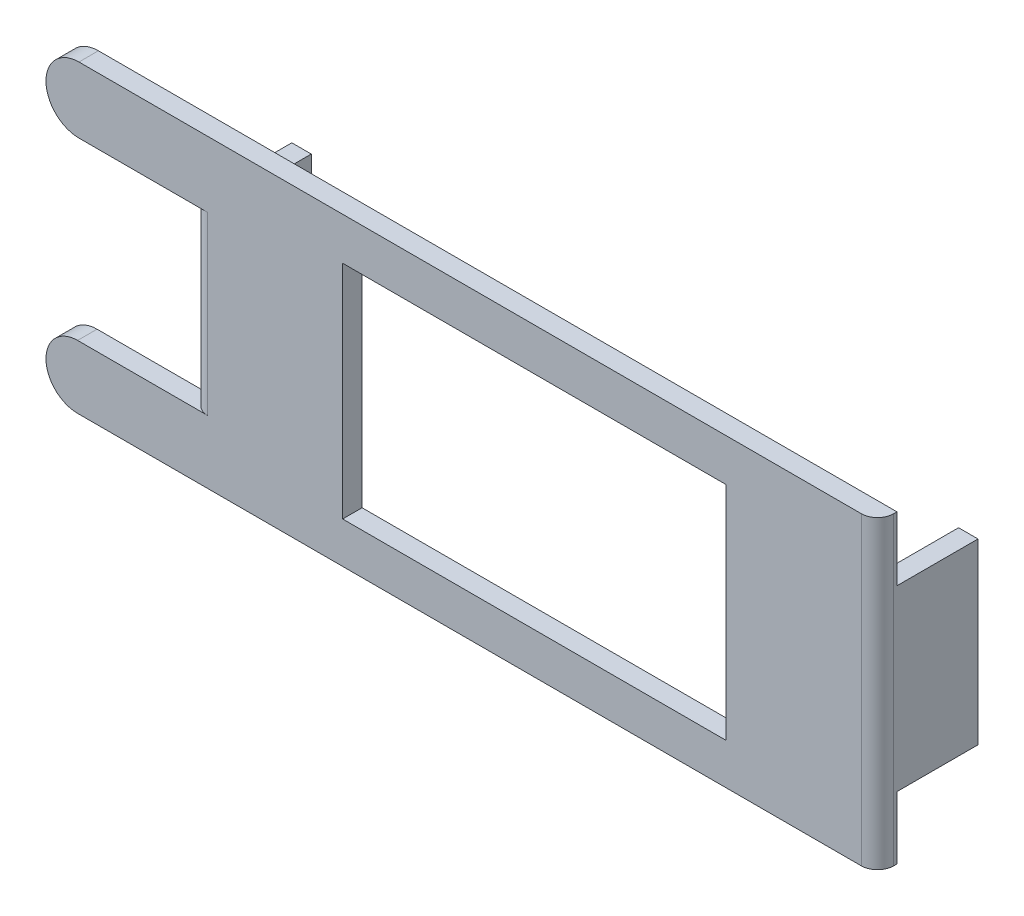
ISO-10303-21;
HEADER;
FILE_DESCRIPTION(('STEP AP214'),'2;1');
FILE_NAME('part.step','',(''),(''),'','','');
FILE_SCHEMA(('AUTOMOTIVE_DESIGN { 1 0 10303 214 1 1 1 1 }'));
ENDSEC;
DATA;
#1=APPLICATION_CONTEXT('core data for automotive mechanical design processes');
#2=APPLICATION_PROTOCOL_DEFINITION('international standard','automotive_design',2000,#1);
#3=PRODUCT_CONTEXT('',#1,'mechanical');
#4=PRODUCT('Part','Part','',(#3));
#5=PRODUCT_RELATED_PRODUCT_CATEGORY('part','',(#4));
#6=PRODUCT_DEFINITION_FORMATION('','',#4);
#7=PRODUCT_DEFINITION_CONTEXT('part definition',#1,'design');
#8=PRODUCT_DEFINITION('design','',#6,#7);
#9=PRODUCT_DEFINITION_SHAPE('','',#8);
#10=(LENGTH_UNIT() NAMED_UNIT(*) SI_UNIT(.MILLI.,.METRE.));
#11=(NAMED_UNIT(*) PLANE_ANGLE_UNIT() SI_UNIT($,.RADIAN.));
#12=(NAMED_UNIT(*) SI_UNIT($,.STERADIAN.) SOLID_ANGLE_UNIT());
#13=UNCERTAINTY_MEASURE_WITH_UNIT(LENGTH_MEASURE(1.E-05),#10,'distance_accuracy_value','');
#14=(GEOMETRIC_REPRESENTATION_CONTEXT(3) GLOBAL_UNCERTAINTY_ASSIGNED_CONTEXT((#13)) GLOBAL_UNIT_ASSIGNED_CONTEXT((#10,
#11,#12)) REPRESENTATION_CONTEXT('',''));
#15=CARTESIAN_POINT('',(0.,0.,0.));
#16=DIRECTION('',(0.,0.,1.));
#17=DIRECTION('',(1.,0.,0.));
#18=AXIS2_PLACEMENT_3D('',#15,#16,#17);
#19=CARTESIAN_POINT('',(-6.35,-1.64,0.));
#20=DIRECTION('',(-1.,0.,0.));
#21=DIRECTION('',(0.,0.,1.));
#22=AXIS2_PLACEMENT_3D('',#19,#20,#21);
#23=PLANE('',#22);
#24=DIRECTION('',(0.,1.,0.));
#25=VECTOR('',#24,1.);
#26=CARTESIAN_POINT('',(-6.35,-1.64,0.));
#27=LINE('',#26,#25);
#28=CARTESIAN_POINT('',(-6.35,-1.65,0.));
#29=VERTEX_POINT('',#28);
#30=CARTESIAN_POINT('',(-6.35,-1.64,0.));
#31=VERTEX_POINT('',#30);
#32=EDGE_CURVE('E233',#29,#31,#27,.T.);
#33=ORIENTED_EDGE('',*,*,#32,.T.);
#34=DIRECTION('',(0.,0.,1.));
#35=VECTOR('',#34,1.);
#36=CARTESIAN_POINT('',(-6.35,-1.64,0.));
#37=LINE('',#36,#35);
#38=CARTESIAN_POINT('',(-6.35,-1.64,0.06));
#39=VERTEX_POINT('',#38);
#40=EDGE_CURVE('E231',#31,#39,#37,.T.);
#41=ORIENTED_EDGE('',*,*,#40,.T.);
#42=DIRECTION('',(0.,1.,0.));
#43=VECTOR('',#42,1.);
#44=CARTESIAN_POINT('',(-6.35,-0.815574764208665,0.0599999999999999));
#45=LINE('',#44,#43);
#46=CARTESIAN_POINT('',(-6.35,1.615,0.06));
#47=VERTEX_POINT('',#46);
#48=EDGE_CURVE('E227',#47,#39,#45,.F.);
#49=ORIENTED_EDGE('',*,*,#48,.F.);
#50=DIRECTION('',(0.,0.,1.));
#51=VECTOR('',#50,1.);
#52=CARTESIAN_POINT('',(-6.35,1.615,0.));
#53=LINE('',#52,#51);
#54=CARTESIAN_POINT('',(-6.35,1.615,0.));
#55=VERTEX_POINT('',#54);
#56=EDGE_CURVE('E222',#47,#55,#53,.F.);
#57=ORIENTED_EDGE('',*,*,#56,.T.);
#58=DIRECTION('',(0.,1.,0.));
#59=VECTOR('',#58,1.);
#60=CARTESIAN_POINT('',(-6.35,-1.64,0.));
#61=LINE('',#60,#59);
#62=CARTESIAN_POINT('',(-6.35,1.65,0.));
#63=VERTEX_POINT('',#62);
#64=EDGE_CURVE('E224',#55,#63,#61,.T.);
#65=ORIENTED_EDGE('',*,*,#64,.T.);
#66=DIRECTION('',(0.,0.,1.));
#67=VECTOR('',#66,1.);
#68=CARTESIAN_POINT('',(-6.35,1.65,0.));
#69=LINE('',#68,#67);
#70=CARTESIAN_POINT('',(-6.35,1.65,-1.5));
#71=VERTEX_POINT('',#70);
#72=EDGE_CURVE('E285',#63,#71,#69,.F.);
#73=ORIENTED_EDGE('',*,*,#72,.T.);
#74=DIRECTION('',(0.,1.,0.));
#75=VECTOR('',#74,1.);
#76=CARTESIAN_POINT('',(-6.35,0.,-1.5));
#77=LINE('',#76,#75);
#78=CARTESIAN_POINT('',(-6.35,-1.65,-1.5));
#79=VERTEX_POINT('',#78);
#80=EDGE_CURVE('E221',#71,#79,#77,.F.);
#81=ORIENTED_EDGE('',*,*,#80,.T.);
#82=DIRECTION('',(0.,0.,1.));
#83=VECTOR('',#82,1.);
#84=CARTESIAN_POINT('',(-6.35,-1.65,0.));
#85=LINE('',#84,#83);
#86=EDGE_CURVE('E276',#79,#29,#85,.T.);
#87=ORIENTED_EDGE('',*,*,#86,.T.);
#88=EDGE_LOOP('',(#33,#41,#49,#57,#65,#73,#81,#87));
#89=FACE_BOUND('',#88,.T.);
#90=ADVANCED_FACE('F17',(#89),#23,.T.);
#91=CARTESIAN_POINT('',(6.35,2.835,0.));
#92=DIRECTION('',(1.,0.,0.));
#93=DIRECTION('',(0.,0.,-1.));
#94=AXIS2_PLACEMENT_3D('',#91,#92,#93);
#95=PLANE('',#94);
#96=DIRECTION('',(0.,1.,0.));
#97=VECTOR('',#96,1.);
#98=CARTESIAN_POINT('',(6.35,2.835,0.));
#99=LINE('',#98,#97);
#100=CARTESIAN_POINT('',(6.35,1.65,0.));
#101=VERTEX_POINT('',#100);
#102=CARTESIAN_POINT('',(6.35,2.835,0.));
#103=VERTEX_POINT('',#102);
#104=EDGE_CURVE('E238',#101,#103,#99,.T.);
#105=ORIENTED_EDGE('',*,*,#104,.T.);
#106=DIRECTION('',(0.,0.,-1.));
#107=VECTOR('',#106,1.);
#108=CARTESIAN_POINT('',(6.35,2.835,0.));
#109=LINE('',#108,#107);
#110=CARTESIAN_POINT('',(6.35,2.835,0.06));
#111=VERTEX_POINT('',#110);
#112=EDGE_CURVE('E174',#103,#111,#109,.F.);
#113=ORIENTED_EDGE('',*,*,#112,.T.);
#114=DIRECTION('',(0.,-1.,0.));
#115=VECTOR('',#114,1.);
#116=CARTESIAN_POINT('',(6.35,1.42192523579134,0.06));
#117=LINE('',#116,#115);
#118=CARTESIAN_POINT('',(6.35,-2.81,0.06));
#119=VERTEX_POINT('',#118);
#120=EDGE_CURVE('E173',#119,#111,#117,.F.);
#121=ORIENTED_EDGE('',*,*,#120,.F.);
#122=DIRECTION('',(0.,0.,-1.));
#123=VECTOR('',#122,1.);
#124=CARTESIAN_POINT('',(6.35,-2.81,0.));
#125=LINE('',#124,#123);
#126=CARTESIAN_POINT('',(6.35,-2.81,0.));
#127=VERTEX_POINT('',#126);
#128=EDGE_CURVE('E169',#119,#127,#125,.T.);
#129=ORIENTED_EDGE('',*,*,#128,.T.);
#130=DIRECTION('',(0.,1.,0.));
#131=VECTOR('',#130,1.);
#132=CARTESIAN_POINT('',(6.35,2.835,0.));
#133=LINE('',#132,#131);
#134=CARTESIAN_POINT('',(6.35,-1.65,0.));
#135=VERTEX_POINT('',#134);
#136=EDGE_CURVE('E242',#127,#135,#133,.T.);
#137=ORIENTED_EDGE('',*,*,#136,.T.);
#138=DIRECTION('',(0.,0.,-1.));
#139=VECTOR('',#138,1.);
#140=CARTESIAN_POINT('',(6.35,-1.65,0.));
#141=LINE('',#140,#139);
#142=CARTESIAN_POINT('',(6.35,-1.65,-1.5));
#143=VERTEX_POINT('',#142);
#144=EDGE_CURVE('E255',#135,#143,#141,.T.);
#145=ORIENTED_EDGE('',*,*,#144,.T.);
#146=DIRECTION('',(0.,1.,0.));
#147=VECTOR('',#146,1.);
#148=CARTESIAN_POINT('',(6.35,0.,-1.5));
#149=LINE('',#148,#147);
#150=CARTESIAN_POINT('',(6.35,1.65,-1.5));
#151=VERTEX_POINT('',#150);
#152=EDGE_CURVE('E216',#143,#151,#149,.T.);
#153=ORIENTED_EDGE('',*,*,#152,.T.);
#154=DIRECTION('',(0.,0.,-1.));
#155=VECTOR('',#154,1.);
#156=CARTESIAN_POINT('',(6.35,1.65,0.));
#157=LINE('',#156,#155);
#158=EDGE_CURVE('E246',#151,#101,#157,.F.);
#159=ORIENTED_EDGE('',*,*,#158,.T.);
#160=EDGE_LOOP('',(#105,#113,#121,#129,#137,#145,#153,#159));
#161=FACE_BOUND('',#160,.T.);
#162=ADVANCED_FACE('F406',(#161),#95,.T.);
#163=CARTESIAN_POINT('',(6.05,1.42192523579134,0.06));
#164=DIRECTION('',(0.,-1.,0.));
#165=DIRECTION('',(0.,0.,-1.));
#166=AXIS2_PLACEMENT_3D('',#163,#164,#165);
#167=CYLINDRICAL_SURFACE('',#166,0.3);
#168=CARTESIAN_POINT('',(6.05,2.835,0.06));
#169=DIRECTION('',(0.,-1.,0.));
#170=DIRECTION('',(0.,0.,-1.));
#171=AXIS2_PLACEMENT_3D('',#168,#169,#170);
#172=CIRCLE('',#171,0.3);
#173=CARTESIAN_POINT('',(6.05,2.835,0.36));
#174=VERTEX_POINT('',#173);
#175=EDGE_CURVE('E179',#111,#174,#172,.T.);
#176=ORIENTED_EDGE('',*,*,#175,.T.);
#177=DIRECTION('',(0.,1.,0.));
#178=VECTOR('',#177,1.);
#179=CARTESIAN_POINT('',(6.05,0.008850471582671,0.36));
#180=LINE('',#179,#178);
#181=CARTESIAN_POINT('',(6.05,-2.81,0.36));
#182=VERTEX_POINT('',#181);
#183=EDGE_CURVE('E176',#182,#174,#180,.T.);
#184=ORIENTED_EDGE('',*,*,#183,.F.);
#185=CARTESIAN_POINT('',(6.05,-2.81,0.06));
#186=DIRECTION('',(0.,-1.,0.));
#187=DIRECTION('',(0.,0.,-1.));
#188=AXIS2_PLACEMENT_3D('',#185,#186,#187);
#189=CIRCLE('',#188,0.3);
#190=EDGE_CURVE('E20',#182,#119,#189,.F.);
#191=ORIENTED_EDGE('',*,*,#190,.T.);
#192=ORIENTED_EDGE('',*,*,#120,.T.);
#193=EDGE_LOOP('',(#176,#184,#191,#192));
#194=FACE_BOUND('',#193,.T.);
#195=ADVANCED_FACE('F177',(#194),#167,.T.);
#196=CARTESIAN_POINT('',(-6.05,-0.815574764208665,0.06));
#197=DIRECTION('',(0.,1.,0.));
#198=DIRECTION('',(0.,0.,1.));
#199=AXIS2_PLACEMENT_3D('',#196,#197,#198);
#200=CYLINDRICAL_SURFACE('',#199,0.3);
#201=CARTESIAN_POINT('',(-6.05,1.615,0.06));
#202=DIRECTION('',(0.,1.,0.));
#203=DIRECTION('',(0.,0.,1.));
#204=AXIS2_PLACEMENT_3D('',#201,#202,#203);
#205=CIRCLE('',#204,0.3);
#206=CARTESIAN_POINT('',(-6.05,1.615,0.36));
#207=VERTEX_POINT('',#206);
#208=EDGE_CURVE('E230',#207,#47,#205,.F.);
#209=ORIENTED_EDGE('',*,*,#208,.T.);
#210=ORIENTED_EDGE('',*,*,#48,.T.);
#211=CARTESIAN_POINT('',(-6.05,-1.64,0.06));
#212=DIRECTION('',(0.,1.,0.));
#213=DIRECTION('',(0.,0.,1.));
#214=AXIS2_PLACEMENT_3D('',#211,#212,#213);
#215=CIRCLE('',#214,0.3);
#216=CARTESIAN_POINT('',(-6.05,-1.64,0.36));
#217=VERTEX_POINT('',#216);
#218=EDGE_CURVE('E320',#39,#217,#215,.T.);
#219=ORIENTED_EDGE('',*,*,#218,.T.);
#220=DIRECTION('',(0.,1.,0.));
#221=VECTOR('',#220,1.);
#222=CARTESIAN_POINT('',(-6.05,0.008850471582671,0.36));
#223=LINE('',#222,#221);
#224=EDGE_CURVE('E183',#207,#217,#223,.F.);
#225=ORIENTED_EDGE('',*,*,#224,.F.);
#226=EDGE_LOOP('',(#209,#210,#219,#225));
#227=FACE_BOUND('',#226,.T.);
#228=ADVANCED_FACE('F324',(#227),#200,.T.);
#229=CARTESIAN_POINT('',(-6.17,0.,-1.5));
#230=DIRECTION('',(0.,0.,1.));
#231=DIRECTION('',(1.,0.,0.));
#232=AXIS2_PLACEMENT_3D('',#229,#230,#231);
#233=PLANE('',#232);
#234=DIRECTION('',(1.,0.,0.));
#235=VECTOR('',#234,1.);
#236=CARTESIAN_POINT('',(-6.35,-1.65,-1.5));
#237=LINE('',#236,#235);
#238=CARTESIAN_POINT('',(-5.99,-1.65,-1.5));
#239=VERTEX_POINT('',#238);
#240=EDGE_CURVE('E281',#79,#239,#237,.T.);
#241=ORIENTED_EDGE('',*,*,#240,.F.);
#242=ORIENTED_EDGE('',*,*,#80,.F.);
#243=DIRECTION('',(1.,0.,0.));
#244=VECTOR('',#243,1.);
#245=CARTESIAN_POINT('',(-5.99,1.65,-1.5));
#246=LINE('',#245,#244);
#247=CARTESIAN_POINT('',(-5.99,1.65,-1.5));
#248=VERTEX_POINT('',#247);
#249=EDGE_CURVE('E217',#248,#71,#246,.F.);
#250=ORIENTED_EDGE('',*,*,#249,.F.);
#251=DIRECTION('',(0.,1.,0.));
#252=VECTOR('',#251,1.);
#253=CARTESIAN_POINT('',(-5.99,-1.65,-1.5));
#254=LINE('',#253,#252);
#255=EDGE_CURVE('E208',#239,#248,#254,.T.);
#256=ORIENTED_EDGE('',*,*,#255,.F.);
#257=EDGE_LOOP('',(#241,#242,#250,#256));
#258=FACE_BOUND('',#257,.T.);
#259=ADVANCED_FACE('F496',(#258),#233,.F.);
#260=CARTESIAN_POINT('',(-5.99,1.65,0.));
#261=DIRECTION('',(0.,1.,0.));
#262=DIRECTION('',(0.,0.,1.));
#263=AXIS2_PLACEMENT_3D('',#260,#261,#262);
#264=PLANE('',#263);
#265=DIRECTION('',(1.,0.,0.));
#266=VECTOR('',#265,1.);
#267=CARTESIAN_POINT('',(-5.99,1.65,0.));
#268=LINE('',#267,#266);
#269=CARTESIAN_POINT('',(-5.99,1.65,0.));
#270=VERTEX_POINT('',#269);
#271=EDGE_CURVE('E220',#63,#270,#268,.T.);
#272=ORIENTED_EDGE('',*,*,#271,.T.);
#273=DIRECTION('',(0.,0.,-1.));
#274=VECTOR('',#273,1.);
#275=CARTESIAN_POINT('',(-5.99,1.65,0.));
#276=LINE('',#275,#274);
#277=EDGE_CURVE('E205',#248,#270,#276,.F.);
#278=ORIENTED_EDGE('',*,*,#277,.F.);
#279=ORIENTED_EDGE('',*,*,#249,.T.);
#280=ORIENTED_EDGE('',*,*,#72,.F.);
#281=EDGE_LOOP('',(#272,#278,#279,#280));
#282=FACE_BOUND('',#281,.T.);
#283=ADVANCED_FACE('F492',(#282),#264,.T.);
#284=CARTESIAN_POINT('',(-6.35,-1.65,0.));
#285=DIRECTION('',(0.,-1.,0.));
#286=DIRECTION('',(0.,0.,-1.));
#287=AXIS2_PLACEMENT_3D('',#284,#285,#286);
#288=PLANE('',#287);
#289=DIRECTION('',(1.,0.,0.));
#290=VECTOR('',#289,1.);
#291=CARTESIAN_POINT('',(-6.35,-1.65,0.));
#292=LINE('',#291,#290);
#293=CARTESIAN_POINT('',(-5.99,-1.65,0.));
#294=VERTEX_POINT('',#293);
#295=EDGE_CURVE('E260',#294,#29,#292,.F.);
#296=ORIENTED_EDGE('',*,*,#295,.T.);
#297=ORIENTED_EDGE('',*,*,#86,.F.);
#298=ORIENTED_EDGE('',*,*,#240,.T.);
#299=DIRECTION('',(0.,0.,-1.));
#300=VECTOR('',#299,1.);
#301=CARTESIAN_POINT('',(-5.99,-1.65,0.));
#302=LINE('',#301,#300);
#303=EDGE_CURVE('E202',#294,#239,#302,.T.);
#304=ORIENTED_EDGE('',*,*,#303,.F.);
#305=EDGE_LOOP('',(#296,#297,#298,#304));
#306=FACE_BOUND('',#305,.T.);
#307=ADVANCED_FACE('F489',(#306),#288,.T.);
#308=CARTESIAN_POINT('',(6.17,0.,-1.5));
#309=DIRECTION('',(0.,0.,1.));
#310=DIRECTION('',(1.,0.,0.));
#311=AXIS2_PLACEMENT_3D('',#308,#309,#310);
#312=PLANE('',#311);
#313=DIRECTION('',(1.,0.,0.));
#314=VECTOR('',#313,1.);
#315=CARTESIAN_POINT('',(5.99,-1.65,-1.5));
#316=LINE('',#315,#314);
#317=CARTESIAN_POINT('',(5.99,-1.65,-1.5));
#318=VERTEX_POINT('',#317);
#319=EDGE_CURVE('E212',#318,#143,#316,.T.);
#320=ORIENTED_EDGE('',*,*,#319,.F.);
#321=DIRECTION('',(0.,1.,0.));
#322=VECTOR('',#321,1.);
#323=CARTESIAN_POINT('',(5.99,1.65,-1.5));
#324=LINE('',#323,#322);
#325=CARTESIAN_POINT('',(5.99,1.65,-1.5));
#326=VERTEX_POINT('',#325);
#327=EDGE_CURVE('E193',#326,#318,#324,.F.);
#328=ORIENTED_EDGE('',*,*,#327,.F.);
#329=DIRECTION('',(1.,0.,0.));
#330=VECTOR('',#329,1.);
#331=CARTESIAN_POINT('',(6.35,1.65,-1.5));
#332=LINE('',#331,#330);
#333=EDGE_CURVE('E251',#151,#326,#332,.F.);
#334=ORIENTED_EDGE('',*,*,#333,.F.);
#335=ORIENTED_EDGE('',*,*,#152,.F.);
#336=EDGE_LOOP('',(#320,#328,#334,#335));
#337=FACE_BOUND('',#336,.T.);
#338=ADVANCED_FACE('F397',(#337),#312,.F.);
#339=CARTESIAN_POINT('',(5.99,-1.65,0.));
#340=DIRECTION('',(0.,-1.,0.));
#341=DIRECTION('',(0.,0.,-1.));
#342=AXIS2_PLACEMENT_3D('',#339,#340,#341);
#343=PLANE('',#342);
#344=DIRECTION('',(1.,0.,0.));
#345=VECTOR('',#344,1.);
#346=CARTESIAN_POINT('',(5.99,-1.65,0.));
#347=LINE('',#346,#345);
#348=CARTESIAN_POINT('',(5.99,-1.65,0.));
#349=VERTEX_POINT('',#348);
#350=EDGE_CURVE('E215',#135,#349,#347,.F.);
#351=ORIENTED_EDGE('',*,*,#350,.T.);
#352=DIRECTION('',(0.,0.,1.));
#353=VECTOR('',#352,1.);
#354=CARTESIAN_POINT('',(5.99,-1.65,0.));
#355=LINE('',#354,#353);
#356=EDGE_CURVE('E385',#318,#349,#355,.T.);
#357=ORIENTED_EDGE('',*,*,#356,.F.);
#358=ORIENTED_EDGE('',*,*,#319,.T.);
#359=ORIENTED_EDGE('',*,*,#144,.F.);
#360=EDGE_LOOP('',(#351,#357,#358,#359));
#361=FACE_BOUND('',#360,.T.);
#362=ADVANCED_FACE('F400',(#361),#343,.T.);
#363=CARTESIAN_POINT('',(6.35,1.65,0.));
#364=DIRECTION('',(0.,1.,0.));
#365=DIRECTION('',(0.,0.,1.));
#366=AXIS2_PLACEMENT_3D('',#363,#364,#365);
#367=PLANE('',#366);
#368=DIRECTION('',(1.,0.,0.));
#369=VECTOR('',#368,1.);
#370=CARTESIAN_POINT('',(6.35,1.65,0.));
#371=LINE('',#370,#369);
#372=CARTESIAN_POINT('',(5.99,1.65,0.));
#373=VERTEX_POINT('',#372);
#374=EDGE_CURVE('E184',#373,#101,#371,.T.);
#375=ORIENTED_EDGE('',*,*,#374,.T.);
#376=ORIENTED_EDGE('',*,*,#158,.F.);
#377=ORIENTED_EDGE('',*,*,#333,.T.);
#378=DIRECTION('',(0.,0.,1.));
#379=VECTOR('',#378,1.);
#380=CARTESIAN_POINT('',(5.99,1.65,0.));
#381=LINE('',#380,#379);
#382=EDGE_CURVE('E383',#373,#326,#381,.F.);
#383=ORIENTED_EDGE('',*,*,#382,.F.);
#384=EDGE_LOOP('',(#375,#376,#377,#383));
#385=FACE_BOUND('',#384,.T.);
#386=ADVANCED_FACE('F404',(#385),#367,.T.);
#387=CARTESIAN_POINT('',(-1.71704351507337,0.008850471582671,0.36));
#388=DIRECTION('',(0.,0.,1.));
#389=DIRECTION('',(1.,0.,0.));
#390=AXIS2_PLACEMENT_3D('',#387,#388,#389);
#391=PLANE('',#390);
#392=DIRECTION('',(0.,1.,0.));
#393=VECTOR('',#392,1.);
#394=CARTESIAN_POINT('',(-3.55,-2.05,0.36));
#395=LINE('',#394,#393);
#396=CARTESIAN_POINT('',(-3.55,-2.05,0.36));
#397=VERTEX_POINT('',#396);
#398=CARTESIAN_POINT('',(-3.55,2.05,0.36));
#399=VERTEX_POINT('',#398);
#400=EDGE_CURVE('E371',#397,#399,#395,.T.);
#401=ORIENTED_EDGE('',*,*,#400,.T.);
#402=DIRECTION('',(1.,0.,0.));
#403=VECTOR('',#402,1.);
#404=CARTESIAN_POINT('',(-3.55,2.05,0.36));
#405=LINE('',#404,#403);
#406=CARTESIAN_POINT('',(3.55,2.05,0.36));
#407=VERTEX_POINT('',#406);
#408=EDGE_CURVE('E366',#399,#407,#405,.T.);
#409=ORIENTED_EDGE('',*,*,#408,.T.);
#410=DIRECTION('',(0.,1.,0.));
#411=VECTOR('',#410,1.);
#412=CARTESIAN_POINT('',(3.55,2.05,0.36));
#413=LINE('',#412,#411);
#414=CARTESIAN_POINT('',(3.55,-2.05,0.36));
#415=VERTEX_POINT('',#414);
#416=EDGE_CURVE('E359',#407,#415,#413,.F.);
#417=ORIENTED_EDGE('',*,*,#416,.T.);
#418=DIRECTION('',(1.,0.,0.));
#419=VECTOR('',#418,1.);
#420=CARTESIAN_POINT('',(3.55,-2.05,0.36));
#421=LINE('',#420,#419);
#422=EDGE_CURVE('E376',#415,#397,#421,.F.);
#423=ORIENTED_EDGE('',*,*,#422,.T.);
#424=EDGE_LOOP('',(#401,#409,#417,#423));
#425=FACE_BOUND('',#424,.T.);
#426=CARTESIAN_POINT('',(-8.455,-2.225,0.36));
#427=DIRECTION('',(0.,0.,1.));
#428=DIRECTION('',(1.,0.,0.));
#429=AXIS2_PLACEMENT_3D('',#426,#427,#428);
#430=CIRCLE('',#429,0.585);
#431=CARTESIAN_POINT('',(-8.455,-2.81,0.36));
#432=VERTEX_POINT('',#431);
#433=CARTESIAN_POINT('',(-8.455,-1.64,0.36));
#434=VERTEX_POINT('',#433);
#435=EDGE_CURVE('E188',#432,#434,#430,.F.);
#436=ORIENTED_EDGE('',*,*,#435,.F.);
#437=DIRECTION('',(1.,0.,0.));
#438=VECTOR('',#437,1.);
#439=CARTESIAN_POINT('',(-6.35,-2.81,0.36));
#440=LINE('',#439,#438);
#441=EDGE_CURVE('E167',#182,#432,#440,.F.);
#442=ORIENTED_EDGE('',*,*,#441,.F.);
#443=ORIENTED_EDGE('',*,*,#183,.T.);
#444=DIRECTION('',(1.,0.,0.));
#445=VECTOR('',#444,1.);
#446=CARTESIAN_POINT('',(-6.35,2.835,0.36));
#447=LINE('',#446,#445);
#448=CARTESIAN_POINT('',(-8.43,2.835,0.36));
#449=VERTEX_POINT('',#448);
#450=EDGE_CURVE('E317',#449,#174,#447,.T.);
#451=ORIENTED_EDGE('',*,*,#450,.F.);
#452=CARTESIAN_POINT('',(-8.43,2.225,0.36));
#453=DIRECTION('',(0.,0.,1.));
#454=DIRECTION('',(1.,0.,0.));
#455=AXIS2_PLACEMENT_3D('',#452,#453,#454);
#456=CIRCLE('',#455,0.61);
#457=CARTESIAN_POINT('',(-8.43,1.615,0.36));
#458=VERTEX_POINT('',#457);
#459=EDGE_CURVE('E314',#458,#449,#456,.F.);
#460=ORIENTED_EDGE('',*,*,#459,.F.);
#461=DIRECTION('',(1.,0.,0.));
#462=VECTOR('',#461,1.);
#463=CARTESIAN_POINT('',(-6.35,1.615,0.36));
#464=LINE('',#463,#462);
#465=EDGE_CURVE('E331',#207,#458,#464,.F.);
#466=ORIENTED_EDGE('',*,*,#465,.F.);
#467=ORIENTED_EDGE('',*,*,#224,.T.);
#468=DIRECTION('',(1.,0.,0.));
#469=VECTOR('',#468,1.);
#470=CARTESIAN_POINT('',(-8.455,-1.64,0.36));
#471=LINE('',#470,#469);
#472=EDGE_CURVE('E199',#434,#217,#471,.T.);
#473=ORIENTED_EDGE('',*,*,#472,.F.);
#474=EDGE_LOOP('',(#436,#442,#443,#451,#460,#466,#467,#473));
#475=FACE_BOUND('',#474,.T.);
#476=ADVANCED_FACE('F186',(#425,#475),#391,.T.);
#477=CARTESIAN_POINT('',(-5.99,-1.65,0.));
#478=DIRECTION('',(1.,0.,0.));
#479=DIRECTION('',(0.,0.,-1.));
#480=AXIS2_PLACEMENT_3D('',#477,#478,#479);
#481=PLANE('',#480);
#482=DIRECTION('',(0.,1.,0.));
#483=VECTOR('',#482,1.);
#484=CARTESIAN_POINT('',(-5.99,0.008850471582671,0.));
#485=LINE('',#484,#483);
#486=EDGE_CURVE('E354',#270,#294,#485,.F.);
#487=ORIENTED_EDGE('',*,*,#486,.T.);
#488=ORIENTED_EDGE('',*,*,#303,.T.);
#489=ORIENTED_EDGE('',*,*,#255,.T.);
#490=ORIENTED_EDGE('',*,*,#277,.T.);
#491=EDGE_LOOP('',(#487,#488,#489,#490));
#492=FACE_BOUND('',#491,.T.);
#493=ADVANCED_FACE('F476',(#492),#481,.T.);
#494=CARTESIAN_POINT('',(-8.455,-1.64,0.));
#495=DIRECTION('',(0.,1.,0.));
#496=DIRECTION('',(0.,0.,1.));
#497=AXIS2_PLACEMENT_3D('',#494,#495,#496);
#498=PLANE('',#497);
#499=DIRECTION('',(1.,0.,0.));
#500=VECTOR('',#499,1.);
#501=CARTESIAN_POINT('',(-1.71704351507337,-1.64,0.));
#502=LINE('',#501,#500);
#503=CARTESIAN_POINT('',(-8.455,-1.64,0.));
#504=VERTEX_POINT('',#503);
#505=EDGE_CURVE('E313',#31,#504,#502,.F.);
#506=ORIENTED_EDGE('',*,*,#505,.T.);
#507=DIRECTION('',(0.,0.,1.));
#508=VECTOR('',#507,1.);
#509=CARTESIAN_POINT('',(-8.455,-1.64,0.));
#510=LINE('',#509,#508);
#511=EDGE_CURVE('E191',#434,#504,#510,.F.);
#512=ORIENTED_EDGE('',*,*,#511,.F.);
#513=ORIENTED_EDGE('',*,*,#472,.T.);
#514=ORIENTED_EDGE('',*,*,#218,.F.);
#515=ORIENTED_EDGE('',*,*,#40,.F.);
#516=EDGE_LOOP('',(#506,#512,#513,#514,#515));
#517=FACE_BOUND('',#516,.T.);
#518=ADVANCED_FACE('F333',(#517),#498,.T.);
#519=CARTESIAN_POINT('',(-8.455,-2.225,0.));
#520=DIRECTION('',(0.,0.,1.));
#521=DIRECTION('',(1.,0.,0.));
#522=AXIS2_PLACEMENT_3D('',#519,#520,#521);
#523=CYLINDRICAL_SURFACE('',#522,0.585);
#524=CARTESIAN_POINT('',(-8.455,-2.225,0.));
#525=DIRECTION('',(0.,0.,1.));
#526=DIRECTION('',(1.,0.,0.));
#527=AXIS2_PLACEMENT_3D('',#524,#525,#526);
#528=CIRCLE('',#527,0.585);
#529=CARTESIAN_POINT('',(-8.455,-2.81,0.));
#530=VERTEX_POINT('',#529);
#531=EDGE_CURVE('E309',#504,#530,#528,.T.);
#532=ORIENTED_EDGE('',*,*,#531,.T.);
#533=DIRECTION('',(0.,0.,-1.));
#534=VECTOR('',#533,1.);
#535=CARTESIAN_POINT('',(-8.455,-2.81,0.));
#536=LINE('',#535,#534);
#537=EDGE_CURVE('E190',#432,#530,#536,.T.);
#538=ORIENTED_EDGE('',*,*,#537,.F.);
#539=ORIENTED_EDGE('',*,*,#435,.T.);
#540=ORIENTED_EDGE('',*,*,#511,.T.);
#541=EDGE_LOOP('',(#532,#538,#539,#540));
#542=FACE_BOUND('',#541,.T.);
#543=ADVANCED_FACE('F337',(#542),#523,.T.);
#544=CARTESIAN_POINT('',(-6.35,-2.81,0.));
#545=DIRECTION('',(0.,-1.,0.));
#546=DIRECTION('',(0.,0.,-1.));
#547=AXIS2_PLACEMENT_3D('',#544,#545,#546);
#548=PLANE('',#547);
#549=DIRECTION('',(1.,0.,0.));
#550=VECTOR('',#549,1.);
#551=CARTESIAN_POINT('',(-1.71704351507337,-2.81,0.));
#552=LINE('',#551,#550);
#553=EDGE_CURVE('E312',#530,#127,#552,.T.);
#554=ORIENTED_EDGE('',*,*,#553,.T.);
#555=ORIENTED_EDGE('',*,*,#128,.F.);
#556=ORIENTED_EDGE('',*,*,#190,.F.);
#557=ORIENTED_EDGE('',*,*,#441,.T.);
#558=ORIENTED_EDGE('',*,*,#537,.T.);
#559=EDGE_LOOP('',(#554,#555,#556,#557,#558));
#560=FACE_BOUND('',#559,.T.);
#561=ADVANCED_FACE('F165',(#560),#548,.T.);
#562=CARTESIAN_POINT('',(5.99,1.65,0.));
#563=DIRECTION('',(-1.,0.,0.));
#564=DIRECTION('',(0.,0.,1.));
#565=AXIS2_PLACEMENT_3D('',#562,#563,#564);
#566=PLANE('',#565);
#567=DIRECTION('',(0.,1.,0.));
#568=VECTOR('',#567,1.);
#569=CARTESIAN_POINT('',(5.99,0.008850471582671,0.));
#570=LINE('',#569,#568);
#571=EDGE_CURVE('E345',#349,#373,#570,.T.);
#572=ORIENTED_EDGE('',*,*,#571,.T.);
#573=ORIENTED_EDGE('',*,*,#382,.T.);
#574=ORIENTED_EDGE('',*,*,#327,.T.);
#575=ORIENTED_EDGE('',*,*,#356,.T.);
#576=EDGE_LOOP('',(#572,#573,#574,#575));
#577=FACE_BOUND('',#576,.T.);
#578=ADVANCED_FACE('F392',(#577),#566,.T.);
#579=CARTESIAN_POINT('',(-6.35,2.835,0.));
#580=DIRECTION('',(0.,1.,0.));
#581=DIRECTION('',(0.,0.,1.));
#582=AXIS2_PLACEMENT_3D('',#579,#580,#581);
#583=PLANE('',#582);
#584=DIRECTION('',(0.,0.,1.));
#585=VECTOR('',#584,1.);
#586=CARTESIAN_POINT('',(-8.43,2.835,0.));
#587=LINE('',#586,#585);
#588=CARTESIAN_POINT('',(-8.43,2.835,0.));
#589=VERTEX_POINT('',#588);
#590=EDGE_CURVE('E316',#449,#589,#587,.F.);
#591=ORIENTED_EDGE('',*,*,#590,.F.);
#592=ORIENTED_EDGE('',*,*,#450,.T.);
#593=ORIENTED_EDGE('',*,*,#175,.F.);
#594=ORIENTED_EDGE('',*,*,#112,.F.);
#595=DIRECTION('',(1.,0.,0.));
#596=VECTOR('',#595,1.);
#597=CARTESIAN_POINT('',(-1.71704351507337,2.835,0.));
#598=LINE('',#597,#596);
#599=EDGE_CURVE('E308',#103,#589,#598,.F.);
#600=ORIENTED_EDGE('',*,*,#599,.T.);
#601=EDGE_LOOP('',(#591,#592,#593,#594,#600));
#602=FACE_BOUND('',#601,.T.);
#603=ADVANCED_FACE('F410',(#602),#583,.T.);
#604=CARTESIAN_POINT('',(-8.43,2.225,0.));
#605=DIRECTION('',(0.,0.,1.));
#606=DIRECTION('',(1.,0.,0.));
#607=AXIS2_PLACEMENT_3D('',#604,#605,#606);
#608=CYLINDRICAL_SURFACE('',#607,0.61);
#609=CARTESIAN_POINT('',(-8.43,2.225,0.));
#610=DIRECTION('',(0.,0.,1.));
#611=DIRECTION('',(1.,0.,0.));
#612=AXIS2_PLACEMENT_3D('',#609,#610,#611);
#613=CIRCLE('',#612,0.61);
#614=CARTESIAN_POINT('',(-8.43,1.615,0.));
#615=VERTEX_POINT('',#614);
#616=EDGE_CURVE('E304',#589,#615,#613,.T.);
#617=ORIENTED_EDGE('',*,*,#616,.T.);
#618=DIRECTION('',(0.,0.,-1.));
#619=VECTOR('',#618,1.);
#620=CARTESIAN_POINT('',(-8.43,1.615,0.));
#621=LINE('',#620,#619);
#622=EDGE_CURVE('E378',#458,#615,#621,.T.);
#623=ORIENTED_EDGE('',*,*,#622,.F.);
#624=ORIENTED_EDGE('',*,*,#459,.T.);
#625=ORIENTED_EDGE('',*,*,#590,.T.);
#626=EDGE_LOOP('',(#617,#623,#624,#625));
#627=FACE_BOUND('',#626,.T.);
#628=ADVANCED_FACE('F414',(#627),#608,.T.);
#629=CARTESIAN_POINT('',(-6.35,1.615,0.));
#630=DIRECTION('',(0.,-1.,0.));
#631=DIRECTION('',(0.,0.,-1.));
#632=AXIS2_PLACEMENT_3D('',#629,#630,#631);
#633=PLANE('',#632);
#634=ORIENTED_EDGE('',*,*,#56,.F.);
#635=ORIENTED_EDGE('',*,*,#208,.F.);
#636=ORIENTED_EDGE('',*,*,#465,.T.);
#637=ORIENTED_EDGE('',*,*,#622,.T.);
#638=DIRECTION('',(1.,0.,0.));
#639=VECTOR('',#638,1.);
#640=CARTESIAN_POINT('',(-1.71704351507337,1.615,0.));
#641=LINE('',#640,#639);
#642=EDGE_CURVE('E307',#615,#55,#641,.T.);
#643=ORIENTED_EDGE('',*,*,#642,.T.);
#644=EDGE_LOOP('',(#634,#635,#636,#637,#643));
#645=FACE_BOUND('',#644,.T.);
#646=ADVANCED_FACE('F419',(#645),#633,.T.);
#647=CARTESIAN_POINT('',(3.55,-2.05,0.));
#648=DIRECTION('',(0.,-1.,0.));
#649=DIRECTION('',(0.,0.,-1.));
#650=AXIS2_PLACEMENT_3D('',#647,#648,#649);
#651=PLANE('',#650);
#652=DIRECTION('',(0.,0.,-1.));
#653=VECTOR('',#652,1.);
#654=CARTESIAN_POINT('',(3.55,-2.05,0.));
#655=LINE('',#654,#653);
#656=CARTESIAN_POINT('',(3.55,-2.05,0.));
#657=VERTEX_POINT('',#656);
#658=EDGE_CURVE('E363',#415,#657,#655,.T.);
#659=ORIENTED_EDGE('',*,*,#658,.T.);
#660=DIRECTION('',(1.,0.,0.));
#661=VECTOR('',#660,1.);
#662=CARTESIAN_POINT('',(-1.71704351507337,-2.05,0.));
#663=LINE('',#662,#661);
#664=CARTESIAN_POINT('',(-3.55,-2.05,0.));
#665=VERTEX_POINT('',#664);
#666=EDGE_CURVE('E422',#657,#665,#663,.F.);
#667=ORIENTED_EDGE('',*,*,#666,.T.);
#668=DIRECTION('',(0.,0.,1.));
#669=VECTOR('',#668,1.);
#670=CARTESIAN_POINT('',(-3.55,-2.05,0.));
#671=LINE('',#670,#669);
#672=EDGE_CURVE('E373',#665,#397,#671,.T.);
#673=ORIENTED_EDGE('',*,*,#672,.T.);
#674=ORIENTED_EDGE('',*,*,#422,.F.);
#675=EDGE_LOOP('',(#659,#667,#673,#674));
#676=FACE_BOUND('',#675,.T.);
#677=ADVANCED_FACE('F445',(#676),#651,.F.);
#678=CARTESIAN_POINT('',(-3.55,-2.05,0.));
#679=DIRECTION('',(-1.,0.,0.));
#680=DIRECTION('',(0.,0.,1.));
#681=AXIS2_PLACEMENT_3D('',#678,#679,#680);
#682=PLANE('',#681);
#683=ORIENTED_EDGE('',*,*,#672,.F.);
#684=DIRECTION('',(0.,1.,0.));
#685=VECTOR('',#684,1.);
#686=CARTESIAN_POINT('',(-3.55,0.008850471582671,0.));
#687=LINE('',#686,#685);
#688=CARTESIAN_POINT('',(-3.55,2.05,0.));
#689=VERTEX_POINT('',#688);
#690=EDGE_CURVE('E425',#665,#689,#687,.T.);
#691=ORIENTED_EDGE('',*,*,#690,.T.);
#692=DIRECTION('',(0.,0.,1.));
#693=VECTOR('',#692,1.);
#694=CARTESIAN_POINT('',(-3.55,2.05,0.));
#695=LINE('',#694,#693);
#696=EDGE_CURVE('E368',#689,#399,#695,.T.);
#697=ORIENTED_EDGE('',*,*,#696,.T.);
#698=ORIENTED_EDGE('',*,*,#400,.F.);
#699=EDGE_LOOP('',(#683,#691,#697,#698));
#700=FACE_BOUND('',#699,.T.);
#701=ADVANCED_FACE('F442',(#700),#682,.F.);
#702=CARTESIAN_POINT('',(-3.55,2.05,0.));
#703=DIRECTION('',(0.,1.,0.));
#704=DIRECTION('',(0.,0.,1.));
#705=AXIS2_PLACEMENT_3D('',#702,#703,#704);
#706=PLANE('',#705);
#707=ORIENTED_EDGE('',*,*,#696,.F.);
#708=DIRECTION('',(1.,0.,0.));
#709=VECTOR('',#708,1.);
#710=CARTESIAN_POINT('',(-1.71704351507337,2.05,0.));
#711=LINE('',#710,#709);
#712=CARTESIAN_POINT('',(3.55,2.05,0.));
#713=VERTEX_POINT('',#712);
#714=EDGE_CURVE('E26',#689,#713,#711,.T.);
#715=ORIENTED_EDGE('',*,*,#714,.T.);
#716=DIRECTION('',(0.,0.,-1.));
#717=VECTOR('',#716,1.);
#718=CARTESIAN_POINT('',(3.55,2.05,0.));
#719=LINE('',#718,#717);
#720=EDGE_CURVE('E34',#713,#407,#719,.F.);
#721=ORIENTED_EDGE('',*,*,#720,.T.);
#722=ORIENTED_EDGE('',*,*,#408,.F.);
#723=EDGE_LOOP('',(#707,#715,#721,#722));
#724=FACE_BOUND('',#723,.T.);
#725=ADVANCED_FACE('F437',(#724),#706,.F.);
#726=CARTESIAN_POINT('',(3.55,2.05,0.));
#727=DIRECTION('',(1.,0.,0.));
#728=DIRECTION('',(0.,0.,-1.));
#729=AXIS2_PLACEMENT_3D('',#726,#727,#728);
#730=PLANE('',#729);
#731=ORIENTED_EDGE('',*,*,#720,.F.);
#732=DIRECTION('',(0.,1.,0.));
#733=VECTOR('',#732,1.);
#734=CARTESIAN_POINT('',(3.55,0.008850471582671,0.));
#735=LINE('',#734,#733);
#736=EDGE_CURVE('E11',#713,#657,#735,.F.);
#737=ORIENTED_EDGE('',*,*,#736,.T.);
#738=ORIENTED_EDGE('',*,*,#658,.F.);
#739=ORIENTED_EDGE('',*,*,#416,.F.);
#740=EDGE_LOOP('',(#731,#737,#738,#739));
#741=FACE_BOUND('',#740,.T.);
#742=ADVANCED_FACE('F447',(#741),#730,.F.);
#743=CARTESIAN_POINT('',(-1.71704351507337,0.008850471582671,0.));
#744=DIRECTION('',(0.,0.,1.));
#745=DIRECTION('',(1.,0.,0.));
#746=AXIS2_PLACEMENT_3D('',#743,#744,#745);
#747=PLANE('',#746);
#748=ORIENTED_EDGE('',*,*,#714,.F.);
#749=ORIENTED_EDGE('',*,*,#690,.F.);
#750=ORIENTED_EDGE('',*,*,#666,.F.);
#751=ORIENTED_EDGE('',*,*,#736,.F.);
#752=EDGE_LOOP('',(#748,#749,#750,#751));
#753=FACE_BOUND('',#752,.T.);
#754=ORIENTED_EDGE('',*,*,#642,.F.);
#755=ORIENTED_EDGE('',*,*,#616,.F.);
#756=ORIENTED_EDGE('',*,*,#599,.F.);
#757=ORIENTED_EDGE('',*,*,#104,.F.);
#758=ORIENTED_EDGE('',*,*,#374,.F.);
#759=ORIENTED_EDGE('',*,*,#571,.F.);
#760=ORIENTED_EDGE('',*,*,#350,.F.);
#761=ORIENTED_EDGE('',*,*,#136,.F.);
#762=ORIENTED_EDGE('',*,*,#553,.F.);
#763=ORIENTED_EDGE('',*,*,#531,.F.);
#764=ORIENTED_EDGE('',*,*,#505,.F.);
#765=ORIENTED_EDGE('',*,*,#32,.F.);
#766=ORIENTED_EDGE('',*,*,#295,.F.);
#767=ORIENTED_EDGE('',*,*,#486,.F.);
#768=ORIENTED_EDGE('',*,*,#271,.F.);
#769=ORIENTED_EDGE('',*,*,#64,.F.);
#770=EDGE_LOOP('',(#754,#755,#756,#757,#758,#759,#760,#761,#762,#763,#764,#765,#766,#767,#768,#769));
#771=FACE_BOUND('',#770,.T.);
#772=ADVANCED_FACE('F341',(#753,#771),#747,.F.);
#773=CLOSED_SHELL('',(#90,#162,#195,#228,#259,#283,#307,#338,#362,#386,#476,#493,#518,#543,#561,
#578,#603,#628,#646,#677,#701,#725,#742,#772));
#774=MANIFOLD_SOLID_BREP('B1',#773);
#775=ADVANCED_BREP_SHAPE_REPRESENTATION('',(#18,#774),#14);
#776=SHAPE_DEFINITION_REPRESENTATION(#9,#775);
ENDSEC;
END-ISO-10303-21;
